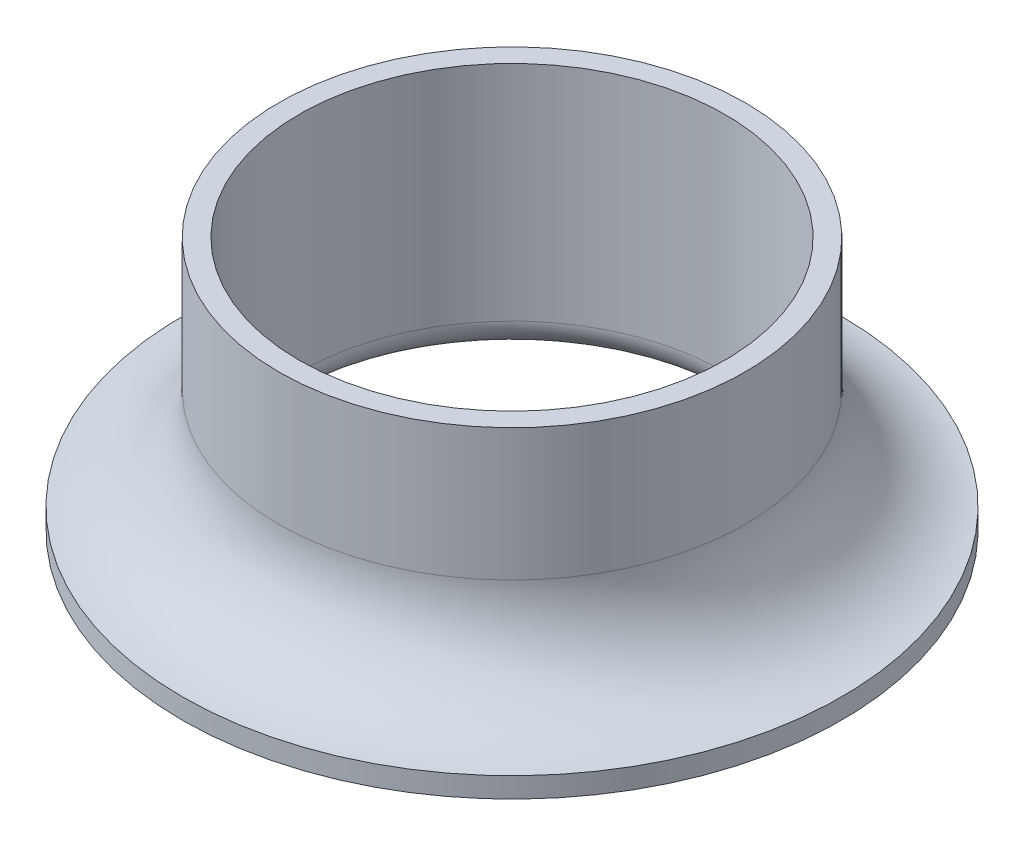
ISO-10303-21;
HEADER;
FILE_DESCRIPTION(('STEP AP214'),'2;1');
FILE_NAME('part.step','',(''),(''),'','','');
FILE_SCHEMA(('AUTOMOTIVE_DESIGN { 1 0 10303 214 1 1 1 1 }'));
ENDSEC;
DATA;
#1=APPLICATION_CONTEXT('core data for automotive mechanical design processes');
#2=APPLICATION_PROTOCOL_DEFINITION('international standard','automotive_design',2000,#1);
#3=PRODUCT_CONTEXT('',#1,'mechanical');
#4=PRODUCT('Part','Part','',(#3));
#5=PRODUCT_RELATED_PRODUCT_CATEGORY('part','',(#4));
#6=PRODUCT_DEFINITION_FORMATION('','',#4);
#7=PRODUCT_DEFINITION_CONTEXT('part definition',#1,'design');
#8=PRODUCT_DEFINITION('design','',#6,#7);
#9=PRODUCT_DEFINITION_SHAPE('','',#8);
#10=(LENGTH_UNIT() NAMED_UNIT(*) SI_UNIT(.MILLI.,.METRE.));
#11=(NAMED_UNIT(*) PLANE_ANGLE_UNIT() SI_UNIT($,.RADIAN.));
#12=(NAMED_UNIT(*) SI_UNIT($,.STERADIAN.) SOLID_ANGLE_UNIT());
#13=UNCERTAINTY_MEASURE_WITH_UNIT(LENGTH_MEASURE(1.E-05),#10,'distance_accuracy_value','');
#14=(GEOMETRIC_REPRESENTATION_CONTEXT(3) GLOBAL_UNCERTAINTY_ASSIGNED_CONTEXT((#13)) GLOBAL_UNIT_ASSIGNED_CONTEXT((#10,
#11,#12)) REPRESENTATION_CONTEXT('',''));
#15=CARTESIAN_POINT('',(0.,0.,0.));
#16=DIRECTION('',(0.,0.,1.));
#17=DIRECTION('',(1.,0.,0.));
#18=AXIS2_PLACEMENT_3D('',#15,#16,#17);
#19=CARTESIAN_POINT('',(0.,25.,0.));
#20=DIRECTION('',(0.,1.,0.));
#21=DIRECTION('',(0.,0.,1.));
#22=AXIS2_PLACEMENT_3D('',#19,#20,#21);
#23=PLANE('',#22);
#24=CARTESIAN_POINT('',(0.,25.,0.));
#25=DIRECTION('',(0.,1.,0.));
#26=DIRECTION('',(0.,0.,1.));
#27=AXIS2_PLACEMENT_3D('',#24,#25,#26);
#28=CIRCLE('',#27,23.);
#29=CARTESIAN_POINT('',(0.,25.,23.));
#30=VERTEX_POINT('',#29);
#31=EDGE_CURVE('E55',#30,#30,#28,.T.);
#32=ORIENTED_EDGE('',*,*,#31,.T.);
#33=EDGE_LOOP('',(#32));
#34=FACE_BOUND('',#33,.T.);
#35=CARTESIAN_POINT('',(0.,25.,0.));
#36=DIRECTION('',(0.,1.,0.));
#37=DIRECTION('',(0.,0.,1.));
#38=AXIS2_PLACEMENT_3D('',#35,#36,#37);
#39=CIRCLE('',#38,21.);
#40=CARTESIAN_POINT('',(0.,25.,21.));
#41=VERTEX_POINT('',#40);
#42=EDGE_CURVE('E61',#41,#41,#39,.T.);
#43=ORIENTED_EDGE('',*,*,#42,.F.);
#44=EDGE_LOOP('',(#43));
#45=FACE_BOUND('',#44,.T.);
#46=ADVANCED_FACE('F37',(#34,#45),#23,.T.);
#47=CARTESIAN_POINT('',(0.,0.,0.));
#48=DIRECTION('',(0.,1.,0.));
#49=DIRECTION('',(0.,0.,1.));
#50=AXIS2_PLACEMENT_3D('',#47,#48,#49);
#51=PLANE('',#50);
#52=CARTESIAN_POINT('',(0.,0.,0.));
#53=DIRECTION('',(0.,1.,0.));
#54=DIRECTION('',(0.,0.,1.));
#55=AXIS2_PLACEMENT_3D('',#52,#53,#54);
#56=CIRCLE('',#55,24.);
#57=CARTESIAN_POINT('',(0.,0.,24.));
#58=VERTEX_POINT('',#57);
#59=EDGE_CURVE('E45',#58,#58,#56,.T.);
#60=ORIENTED_EDGE('',*,*,#59,.T.);
#61=EDGE_LOOP('',(#60));
#62=FACE_BOUND('',#61,.T.);
#63=CARTESIAN_POINT('',(0.,0.,0.));
#64=DIRECTION('',(0.,1.,0.));
#65=DIRECTION('',(0.,0.,1.));
#66=AXIS2_PLACEMENT_3D('',#63,#64,#65);
#67=CIRCLE('',#66,32.5);
#68=CARTESIAN_POINT('',(0.,0.,32.5));
#69=VERTEX_POINT('',#68);
#70=EDGE_CURVE('E66',#69,#69,#67,.T.);
#71=ORIENTED_EDGE('',*,*,#70,.F.);
#72=EDGE_LOOP('',(#71));
#73=FACE_BOUND('',#72,.T.);
#74=ADVANCED_FACE('F84',(#62,#73),#51,.F.);
#75=CARTESIAN_POINT('',(0.,25.,0.));
#76=DIRECTION('',(0.,-1.,0.));
#77=DIRECTION('',(0.,0.,-1.));
#78=AXIS2_PLACEMENT_3D('',#75,#76,#77);
#79=CYLINDRICAL_SURFACE('',#78,23.);
#80=CARTESIAN_POINT('',(0.,11.9874921777191,0.));
#81=DIRECTION('',(0.,-1.,0.));
#82=DIRECTION('',(0.,0.,-1.));
#83=AXIS2_PLACEMENT_3D('',#80,#81,#82);
#84=CIRCLE('',#83,23.);
#85=CARTESIAN_POINT('',(0.,11.9874921777191,-23.));
#86=VERTEX_POINT('',#85);
#87=EDGE_CURVE('E50',#86,#86,#84,.F.);
#88=ORIENTED_EDGE('',*,*,#87,.T.);
#89=EDGE_LOOP('',(#88));
#90=FACE_BOUND('',#89,.T.);
#91=ORIENTED_EDGE('',*,*,#31,.F.);
#92=EDGE_LOOP('',(#91));
#93=FACE_BOUND('',#92,.T.);
#94=ADVANCED_FACE('F86',(#90,#93),#79,.T.);
#95=CARTESIAN_POINT('',(0.,25.,0.));
#96=DIRECTION('',(0.,-1.,0.));
#97=DIRECTION('',(0.,0.,-1.));
#98=AXIS2_PLACEMENT_3D('',#95,#96,#97);
#99=CYLINDRICAL_SURFACE('',#98,21.);
#100=CARTESIAN_POINT('',(0.,3.,0.));
#101=DIRECTION('',(0.,1.,0.));
#102=DIRECTION('',(0.,0.,1.));
#103=AXIS2_PLACEMENT_3D('',#100,#101,#102);
#104=CIRCLE('',#103,21.);
#105=CARTESIAN_POINT('',(0.,3.,21.));
#106=VERTEX_POINT('',#105);
#107=EDGE_CURVE('E10',#106,#106,#104,.F.);
#108=ORIENTED_EDGE('',*,*,#107,.T.);
#109=EDGE_LOOP('',(#108));
#110=FACE_BOUND('',#109,.T.);
#111=ORIENTED_EDGE('',*,*,#42,.T.);
#112=EDGE_LOOP('',(#111));
#113=FACE_BOUND('',#112,.T.);
#114=ADVANCED_FACE('F80',(#110,#113),#99,.F.);
#115=CARTESIAN_POINT('',(0.,2.,0.));
#116=DIRECTION('',(0.,-1.,0.));
#117=DIRECTION('',(0.,0.,-1.));
#118=AXIS2_PLACEMENT_3D('',#115,#116,#117);
#119=CYLINDRICAL_SURFACE('',#118,32.5);
#120=CARTESIAN_POINT('',(0.,2.,0.));
#121=DIRECTION('',(0.,1.,0.));
#122=DIRECTION('',(0.,0.,1.));
#123=AXIS2_PLACEMENT_3D('',#120,#121,#122);
#124=CIRCLE('',#123,32.5);
#125=CARTESIAN_POINT('',(0.,2.,32.5));
#126=VERTEX_POINT('',#125);
#127=EDGE_CURVE('E65',#126,#126,#124,.T.);
#128=ORIENTED_EDGE('',*,*,#127,.F.);
#129=EDGE_LOOP('',(#128));
#130=FACE_BOUND('',#129,.T.);
#131=ORIENTED_EDGE('',*,*,#70,.T.);
#132=EDGE_LOOP('',(#131));
#133=FACE_BOUND('',#132,.T.);
#134=ADVANCED_FACE('F77',(#130,#133),#119,.T.);
#135=CARTESIAN_POINT('',(0.,11.9874921777191,0.));
#136=DIRECTION('',(0.,-1.,0.));
#137=DIRECTION('',(0.,0.,-1.));
#138=AXIS2_PLACEMENT_3D('',#135,#136,#137);
#139=TOROIDAL_SURFACE('',#138,33.,10.);
#140=ORIENTED_EDGE('',*,*,#127,.T.);
#141=EDGE_LOOP('',(#140));
#142=FACE_BOUND('',#141,.T.);
#143=ORIENTED_EDGE('',*,*,#87,.F.);
#144=EDGE_LOOP('',(#143));
#145=FACE_BOUND('',#144,.T.);
#146=ADVANCED_FACE('F74',(#142,#145),#139,.F.);
#147=CARTESIAN_POINT('',(0.,3.,0.));
#148=DIRECTION('',(0.,1.,0.));
#149=DIRECTION('',(0.,0.,1.));
#150=AXIS2_PLACEMENT_3D('',#147,#148,#149);
#151=TOROIDAL_SURFACE('',#150,24.,3.);
#152=ORIENTED_EDGE('',*,*,#107,.F.);
#153=EDGE_LOOP('',(#152));
#154=FACE_BOUND('',#153,.T.);
#155=ORIENTED_EDGE('',*,*,#59,.F.);
#156=EDGE_LOOP('',(#155));
#157=FACE_BOUND('',#156,.T.);
#158=ADVANCED_FACE('F39',(#154,#157),#151,.T.);
#159=CLOSED_SHELL('',(#46,#74,#94,#114,#134,#146,#158));
#160=MANIFOLD_SOLID_BREP('B2',#159);
#161=ADVANCED_BREP_SHAPE_REPRESENTATION('',(#18,#160),#14);
#162=SHAPE_DEFINITION_REPRESENTATION(#9,#161);
ENDSEC;
END-ISO-10303-21;
